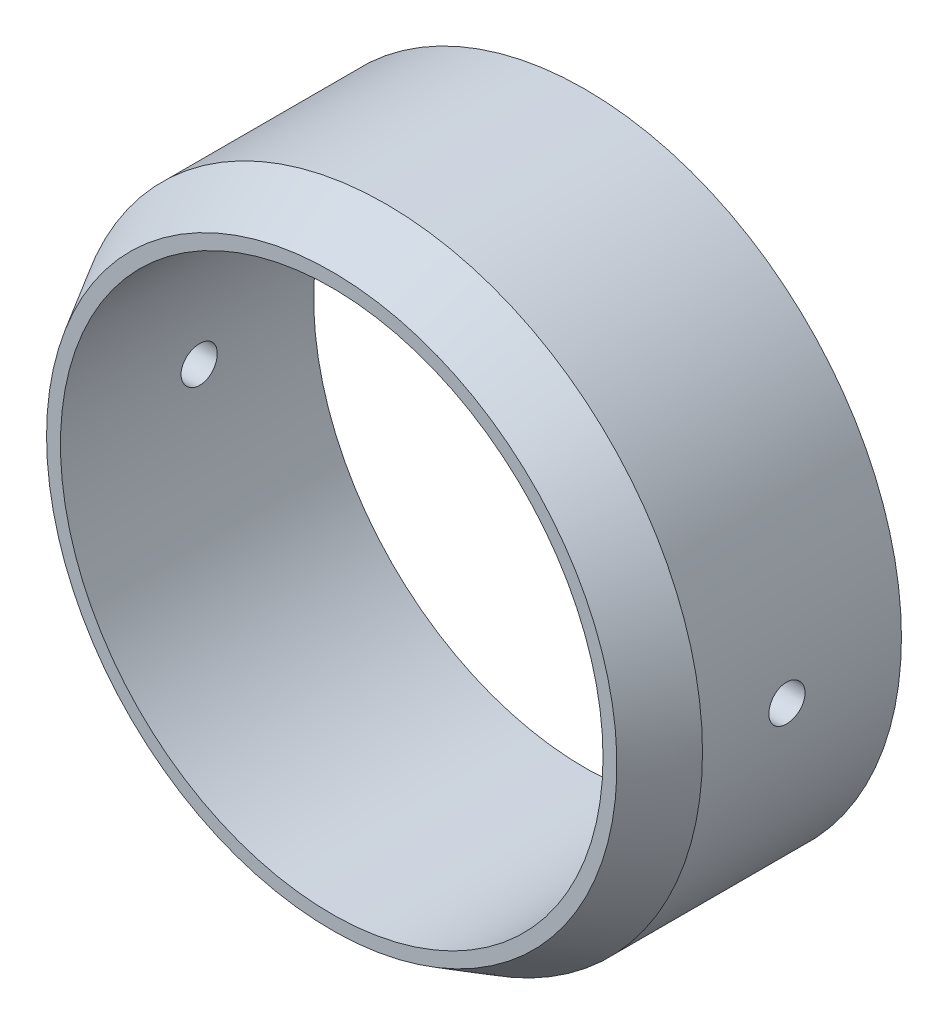
ISO-10303-21;
HEADER;
FILE_DESCRIPTION(('STEP AP214'),'2;1');
FILE_NAME('part.step','',(''),(''),'','','');
FILE_SCHEMA(('AUTOMOTIVE_DESIGN { 1 0 10303 214 1 1 1 1 }'));
ENDSEC;
DATA;
#1=APPLICATION_CONTEXT('core data for automotive mechanical design processes');
#2=APPLICATION_PROTOCOL_DEFINITION('international standard','automotive_design',2000,#1);
#3=PRODUCT_CONTEXT('',#1,'mechanical');
#4=PRODUCT('Part','Part','',(#3));
#5=PRODUCT_RELATED_PRODUCT_CATEGORY('part','',(#4));
#6=PRODUCT_DEFINITION_FORMATION('','',#4);
#7=PRODUCT_DEFINITION_CONTEXT('part definition',#1,'design');
#8=PRODUCT_DEFINITION('design','',#6,#7);
#9=PRODUCT_DEFINITION_SHAPE('','',#8);
#10=(LENGTH_UNIT() NAMED_UNIT(*) SI_UNIT(.MILLI.,.METRE.));
#11=(NAMED_UNIT(*) PLANE_ANGLE_UNIT() SI_UNIT($,.RADIAN.));
#12=(NAMED_UNIT(*) SI_UNIT($,.STERADIAN.) SOLID_ANGLE_UNIT());
#13=UNCERTAINTY_MEASURE_WITH_UNIT(LENGTH_MEASURE(1.E-05),#10,'distance_accuracy_value','');
#14=(GEOMETRIC_REPRESENTATION_CONTEXT(3) GLOBAL_UNCERTAINTY_ASSIGNED_CONTEXT((#13)) GLOBAL_UNIT_ASSIGNED_CONTEXT((#10,
#11,#12)) REPRESENTATION_CONTEXT('',''));
#15=CARTESIAN_POINT('',(0.,0.,0.));
#16=DIRECTION('',(0.,0.,1.));
#17=DIRECTION('',(1.,0.,0.));
#18=AXIS2_PLACEMENT_3D('',#15,#16,#17);
#19=CARTESIAN_POINT('',(0.,0.,35.56));
#20=DIRECTION('',(0.,0.,1.));
#21=DIRECTION('',(1.,0.,0.));
#22=AXIS2_PLACEMENT_3D('',#19,#20,#21);
#23=PLANE('',#22);
#24=CARTESIAN_POINT('',(0.,0.,35.56));
#25=DIRECTION('',(0.,0.,1.));
#26=DIRECTION('',(1.,0.,0.));
#27=AXIS2_PLACEMENT_3D('',#24,#25,#26);
#28=CIRCLE('',#27,40.0505909487751);
#29=CARTESIAN_POINT('',(-40.0505909487751,0.,35.56));
#30=VERTEX_POINT('',#29);
#31=EDGE_CURVE('E51',#30,#30,#28,.T.);
#32=ORIENTED_EDGE('',*,*,#31,.T.);
#33=EDGE_LOOP('',(#32));
#34=FACE_BOUND('',#33,.T.);
#35=CARTESIAN_POINT('',(0.,0.,35.56));
#36=DIRECTION('',(0.,0.,1.));
#37=DIRECTION('',(1.,0.,0.));
#38=AXIS2_PLACEMENT_3D('',#35,#36,#37);
#39=CIRCLE('',#38,38.1);
#40=CARTESIAN_POINT('',(38.1,0.,35.56));
#41=VERTEX_POINT('',#40);
#42=EDGE_CURVE('E107',#41,#41,#39,.T.);
#43=ORIENTED_EDGE('',*,*,#42,.F.);
#44=EDGE_LOOP('',(#43));
#45=FACE_BOUND('',#44,.T.);
#46=ADVANCED_FACE('F37',(#34,#45),#23,.T.);
#47=CARTESIAN_POINT('',(0.,0.,0.));
#48=DIRECTION('',(0.,0.,1.));
#49=DIRECTION('',(1.,0.,0.));
#50=AXIS2_PLACEMENT_3D('',#47,#48,#49);
#51=PLANE('',#50);
#52=CARTESIAN_POINT('',(0.,0.,0.));
#53=DIRECTION('',(0.,0.,1.));
#54=DIRECTION('',(1.,0.,0.));
#55=AXIS2_PLACEMENT_3D('',#52,#53,#54);
#56=CIRCLE('',#55,44.45);
#57=CARTESIAN_POINT('',(44.45,0.,0.));
#58=VERTEX_POINT('',#57);
#59=EDGE_CURVE('E57',#58,#58,#56,.T.);
#60=ORIENTED_EDGE('',*,*,#59,.F.);
#61=EDGE_LOOP('',(#60));
#62=FACE_BOUND('',#61,.T.);
#63=CARTESIAN_POINT('',(0.,0.,0.));
#64=DIRECTION('',(0.,0.,1.));
#65=DIRECTION('',(1.,0.,0.));
#66=AXIS2_PLACEMENT_3D('',#63,#64,#65);
#67=CIRCLE('',#66,38.1);
#68=CARTESIAN_POINT('',(38.1,0.,0.));
#69=VERTEX_POINT('',#68);
#70=EDGE_CURVE('E110',#69,#69,#67,.T.);
#71=ORIENTED_EDGE('',*,*,#70,.T.);
#72=EDGE_LOOP('',(#71));
#73=FACE_BOUND('',#72,.T.);
#74=ADVANCED_FACE('F94',(#62,#73),#51,.F.);
#75=CARTESIAN_POINT('',(0.,0.,35.56));
#76=DIRECTION('',(0.,0.,-1.));
#77=DIRECTION('',(-1.,0.,0.));
#78=AXIS2_PLACEMENT_3D('',#75,#76,#77);
#79=CYLINDRICAL_SURFACE('',#78,44.45);
#80=CARTESIAN_POINT('',(-44.45,0.,13.5382));
#81=CARTESIAN_POINT('',(-44.4499990324189,0.142548110969174,13.5382062809326));
#82=CARTESIAN_POINT('',(-44.4493069487451,0.285196616573273,13.5502402929722));
#83=CARTESIAN_POINT('',(-44.4466126248642,0.566556457090526,13.5980745659668));
#84=CARTESIAN_POINT('',(-44.4446088512392,0.705262985404416,13.6339026438486));
#85=CARTESIAN_POINT('',(-44.4395178795271,0.974622519959309,13.7282941164584));
#86=CARTESIAN_POINT('',(-44.4364312442148,1.1052796681625,13.7868457032124));
#87=CARTESIAN_POINT('',(-44.4295219231351,1.35487635297572,13.9250034363416));
#88=CARTESIAN_POINT('',(-44.4256994083529,1.47381860191533,14.0046046933229));
#89=CARTESIAN_POINT('',(-44.417742699632,1.69679560844934,14.1827141092181));
#90=CARTESIAN_POINT('',(-44.4136081609573,1.80081349791098,14.2812433718317));
#91=CARTESIAN_POINT('',(-44.4054963468139,1.99084503945253,14.494368918757));
#92=CARTESIAN_POINT('',(-44.4015190778544,2.07685794696125,14.6089658671987));
#93=CARTESIAN_POINT('',(-44.3941677388462,2.2284878908032,14.8510667198102));
#94=CARTESIAN_POINT('',(-44.3907940746642,2.29409122538185,14.9785792188982));
#95=CARTESIAN_POINT('',(-44.3850347565849,2.40295203059249,15.2428312070954));
#96=CARTESIAN_POINT('',(-44.3826490934902,2.44620970924265,15.3795706102969));
#97=CARTESIAN_POINT('',(-44.3791380294191,2.50910528831791,15.6582350486536));
#98=CARTESIAN_POINT('',(-44.3780112417441,2.52876917995537,15.8001541997453));
#99=CARTESIAN_POINT('',(-44.3771408387526,2.54399921632155,16.0852830763599));
#100=CARTESIAN_POINT('',(-44.3773972099368,2.53956559623517,16.2284927892737));
#101=CARTESIAN_POINT('',(-44.3792629258193,2.50674806430771,16.5119606900492));
#102=CARTESIAN_POINT('',(-44.3808706828291,2.47839225753024,16.6522221435788));
#103=CARTESIAN_POINT('',(-44.3852554740054,2.39857884530307,16.9259910868181));
#104=CARTESIAN_POINT('',(-44.3880325142384,2.34712111999487,17.0594985414823));
#105=CARTESIAN_POINT('',(-44.3944447270903,2.22253257271578,17.3160601134959));
#106=CARTESIAN_POINT('',(-44.3980804054095,2.14938897220624,17.4391080123245));
#107=CARTESIAN_POINT('',(-44.4057996399773,1.98351423300362,17.6711895986928));
#108=CARTESIAN_POINT('',(-44.4098832004071,1.89078291144249,17.7802231553813));
#109=CARTESIAN_POINT('',(-44.4180450318436,1.6882065990933,17.9813445417599));
#110=CARTESIAN_POINT('',(-44.4221232868888,1.57833727855314,18.0734078681274));
#111=CARTESIAN_POINT('',(-44.4298092556839,1.34468914280825,18.2377865359344));
#112=CARTESIAN_POINT('',(-44.4334169692932,1.22091032344745,18.3101018714731));
#113=CARTESIAN_POINT('',(-44.439755519285,0.962942193062774,18.4329295924821));
#114=CARTESIAN_POINT('',(-44.4424863196787,0.828752455052521,18.483441083146));
#115=CARTESIAN_POINT('',(-44.4467628003787,0.553778150400031,18.561211071254));
#116=CARTESIAN_POINT('',(-44.4483084922605,0.412993648185005,18.588469795815));
#117=CARTESIAN_POINT('',(-44.4500390787318,0.129038823810357,18.618930188302));
#118=CARTESIAN_POINT('',(-44.450225890018,-0.0141278523047366,18.6221657409656));
#119=CARTESIAN_POINT('',(-44.4492227569685,-0.298969994879581,18.6045764307314));
#120=CARTESIAN_POINT('',(-44.4480328186059,-0.440645467806297,18.5837516722204));
#121=CARTESIAN_POINT('',(-44.4444114083407,-0.718388333463661,18.5186609294604));
#122=CARTESIAN_POINT('',(-44.4419807580683,-0.854459373225275,18.4744104575802));
#123=CARTESIAN_POINT('',(-44.4361514716486,-1.11724328229386,18.3637401378942));
#124=CARTESIAN_POINT('',(-44.4327528282173,-1.24395608117207,18.2973201232643));
#125=CARTESIAN_POINT('',(-44.4253648664061,-1.48458195883466,18.1441096537158));
#126=CARTESIAN_POINT('',(-44.4213748925417,-1.59848058355821,18.0572965299346));
#127=CARTESIAN_POINT('',(-44.4132556389646,-1.81009952321742,17.8657972000757));
#128=CARTESIAN_POINT('',(-44.409126358099,-1.90781970421529,17.7611108460441));
#129=CARTESIAN_POINT('',(-44.40118837965,-2.08442230346029,17.5366907167522));
#130=CARTESIAN_POINT('',(-44.3973800590236,-2.16328276589876,17.4169396486957));
#131=CARTESIAN_POINT('',(-44.3905194282829,-2.29977724439363,17.1658765036846));
#132=CARTESIAN_POINT('',(-44.3874671141291,-2.35741137386724,17.0345644885074));
#133=CARTESIAN_POINT('',(-44.3824654107082,-2.44977902365166,16.7641876326082));
#134=CARTESIAN_POINT('',(-44.3805153521082,-2.48452644379505,16.6251275533025));
#135=CARTESIAN_POINT('',(-44.3779361994804,-2.53017974876046,16.3431356139566));
#136=CARTESIAN_POINT('',(-44.3773070949042,-2.5410858239653,16.2002037848432));
#137=CARTESIAN_POINT('',(-44.3774410498713,-2.53874505508096,15.9147440588276));
#138=CARTESIAN_POINT('',(-44.3782021193232,-2.52553273748035,15.7722158765856));
#139=CARTESIAN_POINT('',(-44.3810264407149,-2.47540172067651,15.4914050100724));
#140=CARTESIAN_POINT('',(-44.3830896950738,-2.4384829774323,15.3531223336889));
#141=CARTESIAN_POINT('',(-44.3882853891516,-2.34199457776633,15.0847217771291));
#142=CARTESIAN_POINT('',(-44.3914178290496,-2.2824249175511,14.9546038983201));
#143=CARTESIAN_POINT('',(-44.3983987975748,-2.14233083223591,14.7062126919853));
#144=CARTESIAN_POINT('',(-44.4022473060956,-2.06180699547971,14.5879390320307));
#145=CARTESIAN_POINT('',(-44.4102330656436,-1.88196406448632,14.3664194528695));
#146=CARTESIAN_POINT('',(-44.4143706907681,-1.78262032329066,14.2631935578065));
#147=CARTESIAN_POINT('',(-44.4224653916266,-1.56798482474032,14.074850101875));
#148=CARTESIAN_POINT('',(-44.4264224228277,-1.45268916175373,13.9897369886912));
#149=CARTESIAN_POINT('',(-44.4337135223396,-1.20931004986795,13.8399829628417));
#150=CARTESIAN_POINT('',(-44.437046894753,-1.08121255784549,13.7753648639142));
#151=CARTESIAN_POINT('',(-44.4427052976532,-0.816061906225686,13.6686313240014));
#152=CARTESIAN_POINT('',(-44.4450315130628,-0.679019490095359,13.6264894260914));
#153=CARTESIAN_POINT('',(-44.447801300932,-0.450943893387478,13.5769035816224));
#154=CARTESIAN_POINT('',(-44.4486221673832,-0.361386382398327,13.5624083974629));
#155=CARTESIAN_POINT('',(-44.4497218242187,-0.181232776087378,13.5430546153194));
#156=CARTESIAN_POINT('',(-44.4500006152192,-0.090636681946349,13.5381960063806));
#157=CARTESIAN_POINT('',(-44.45,0.,13.5382));
#158=B_SPLINE_CURVE_WITH_KNOTS('',3,(#80,#81,#82,#83,#84,#85,#86,#87,#88,#89,#90,#91,#92,#93,
#94,#95,#96,#97,#98,#99,#100,#101,#102,#103,#104,#105,#106,#107,#108,#109,#110,#111,#112,#113,
#114,#115,#116,#117,#118,#119,#120,#121,#122,#123,#124,#125,#126,#127,#128,#129,#130,#131,#132,
#133,#134,#135,#136,#137,#138,#139,#140,#141,#142,#143,#144,#145,#146,#147,#148,#149,#150,#151,
#152,#153,#154,#155,#156,#157),.UNSPECIFIED.,.T.,.F.,(4,2,2,2,2,2,2,2,2,2,2,2,2,2,2,2,2,2,2,2,2,
2,2,2,2,2,2,2,2,2,2,2,2,2,2,2,2,2,4),(0.,0.427313464374931,0.855127369531934,1.28271926380893,
1.71021192462679,2.13818401226944,2.56617379461238,2.9944502864928,3.4227227914283,
3.85052307155006,4.27831917646952,4.70561338244867,5.13290980536226,5.56045851751044,
5.98801122136637,6.4161765140174,6.84434193460178,7.27252492496605,7.70070373309051,
8.12827847910963,8.55585137008207,8.9831414783331,9.41043480197916,9.8382053690021,
10.2659794772668,10.6942491866998,11.1225166077552,11.5505236878496,11.9785273501211,
12.4059187876659,12.8333110192064,13.2607033223246,13.6880836265711,14.116027555884,
14.5440764480341,14.9726001580508,15.4006183296802,15.6723183075114,15.9440179764766),.UNSPECIFIED.);
#159=CARTESIAN_POINT('',(-44.45,0.,13.5382));
#160=VERTEX_POINT('',#159);
#161=EDGE_CURVE('E85',#160,#160,#158,.T.);
#162=ORIENTED_EDGE('',*,*,#161,.T.);
#163=EDGE_LOOP('',(#162));
#164=FACE_BOUND('',#163,.T.);
#165=CARTESIAN_POINT('',(44.45,0.,13.5382));
#166=CARTESIAN_POINT('',(44.4499990324189,-0.142548110969174,13.5382062809326));
#167=CARTESIAN_POINT('',(44.4493069487451,-0.285196616573273,13.5502402929722));
#168=CARTESIAN_POINT('',(44.4466126248642,-0.566556457090526,13.5980745659668));
#169=CARTESIAN_POINT('',(44.4446088512392,-0.705262985404416,13.6339026438486));
#170=CARTESIAN_POINT('',(44.4395178795271,-0.974622519959309,13.7282941164584));
#171=CARTESIAN_POINT('',(44.4364312442148,-1.1052796681625,13.7868457032124));
#172=CARTESIAN_POINT('',(44.4295219231351,-1.35487635297572,13.9250034363416));
#173=CARTESIAN_POINT('',(44.4256994083529,-1.47381860191533,14.0046046933229));
#174=CARTESIAN_POINT('',(44.417742699632,-1.69679560844934,14.1827141092181));
#175=CARTESIAN_POINT('',(44.4136081609573,-1.80081349791098,14.2812433718317));
#176=CARTESIAN_POINT('',(44.4054963468139,-1.99084503945253,14.494368918757));
#177=CARTESIAN_POINT('',(44.4015190778544,-2.07685794696125,14.6089658671987));
#178=CARTESIAN_POINT('',(44.3941677388462,-2.2284878908032,14.8510667198102));
#179=CARTESIAN_POINT('',(44.3907940746642,-2.29409122538185,14.9785792188982));
#180=CARTESIAN_POINT('',(44.3850347565849,-2.40295203059249,15.2428312070954));
#181=CARTESIAN_POINT('',(44.3826490934902,-2.44620970924265,15.3795706102969));
#182=CARTESIAN_POINT('',(44.3791380294191,-2.50910528831791,15.6582350486536));
#183=CARTESIAN_POINT('',(44.3780112417441,-2.52876917995537,15.8001541997453));
#184=CARTESIAN_POINT('',(44.3771408387526,-2.54399921632155,16.0852830763599));
#185=CARTESIAN_POINT('',(44.3773972099368,-2.53956559623517,16.2284927892737));
#186=CARTESIAN_POINT('',(44.3792629258193,-2.50674806430771,16.5119606900492));
#187=CARTESIAN_POINT('',(44.3808706828291,-2.47839225753024,16.6522221435788));
#188=CARTESIAN_POINT('',(44.3852554740054,-2.39857884530307,16.9259910868181));
#189=CARTESIAN_POINT('',(44.3880325142384,-2.34712111999487,17.0594985414823));
#190=CARTESIAN_POINT('',(44.3944447270903,-2.22253257271578,17.3160601134959));
#191=CARTESIAN_POINT('',(44.3980804054095,-2.14938897220624,17.4391080123245));
#192=CARTESIAN_POINT('',(44.4057996399773,-1.98351423300362,17.6711895986928));
#193=CARTESIAN_POINT('',(44.4098832004071,-1.89078291144249,17.7802231553813));
#194=CARTESIAN_POINT('',(44.4180450318436,-1.6882065990933,17.9813445417599));
#195=CARTESIAN_POINT('',(44.4221232868888,-1.57833727855314,18.0734078681274));
#196=CARTESIAN_POINT('',(44.4298092556839,-1.34468914280825,18.2377865359344));
#197=CARTESIAN_POINT('',(44.4334169692932,-1.22091032344745,18.3101018714731));
#198=CARTESIAN_POINT('',(44.439755519285,-0.962942193062774,18.4329295924821));
#199=CARTESIAN_POINT('',(44.4424863196787,-0.828752455052521,18.483441083146));
#200=CARTESIAN_POINT('',(44.4467628003787,-0.553778150400031,18.561211071254));
#201=CARTESIAN_POINT('',(44.4483084922605,-0.412993648185005,18.588469795815));
#202=CARTESIAN_POINT('',(44.4500390787318,-0.129038823810357,18.618930188302));
#203=CARTESIAN_POINT('',(44.450225890018,0.0141278523047366,18.6221657409656));
#204=CARTESIAN_POINT('',(44.4492227569685,0.298969994879581,18.6045764307314));
#205=CARTESIAN_POINT('',(44.4480328186059,0.440645467806297,18.5837516722204));
#206=CARTESIAN_POINT('',(44.4444114083407,0.718388333463661,18.5186609294604));
#207=CARTESIAN_POINT('',(44.4419807580683,0.854459373225275,18.4744104575802));
#208=CARTESIAN_POINT('',(44.4361514716486,1.11724328229386,18.3637401378942));
#209=CARTESIAN_POINT('',(44.4327528282173,1.24395608117207,18.2973201232643));
#210=CARTESIAN_POINT('',(44.4253648664061,1.48458195883466,18.1441096537158));
#211=CARTESIAN_POINT('',(44.4213748925417,1.59848058355821,18.0572965299346));
#212=CARTESIAN_POINT('',(44.4132556389646,1.81009952321742,17.8657972000757));
#213=CARTESIAN_POINT('',(44.409126358099,1.90781970421529,17.7611108460441));
#214=CARTESIAN_POINT('',(44.40118837965,2.08442230346029,17.5366907167522));
#215=CARTESIAN_POINT('',(44.3973800590236,2.16328276589876,17.4169396486957));
#216=CARTESIAN_POINT('',(44.3905194282829,2.29977724439363,17.1658765036846));
#217=CARTESIAN_POINT('',(44.3874671141291,2.35741137386724,17.0345644885074));
#218=CARTESIAN_POINT('',(44.3824654107082,2.44977902365166,16.7641876326082));
#219=CARTESIAN_POINT('',(44.3805153521082,2.48452644379505,16.6251275533025));
#220=CARTESIAN_POINT('',(44.3779361994804,2.53017974876046,16.3431356139566));
#221=CARTESIAN_POINT('',(44.3773070949042,2.5410858239653,16.2002037848432));
#222=CARTESIAN_POINT('',(44.3774410498713,2.53874505508096,15.9147440588276));
#223=CARTESIAN_POINT('',(44.3782021193232,2.52553273748035,15.7722158765856));
#224=CARTESIAN_POINT('',(44.3810264407149,2.47540172067651,15.4914050100724));
#225=CARTESIAN_POINT('',(44.3830896950738,2.4384829774323,15.3531223336889));
#226=CARTESIAN_POINT('',(44.3882853891516,2.34199457776633,15.0847217771291));
#227=CARTESIAN_POINT('',(44.3914178290496,2.2824249175511,14.9546038983201));
#228=CARTESIAN_POINT('',(44.3983987975748,2.14233083223591,14.7062126919853));
#229=CARTESIAN_POINT('',(44.4022473060956,2.06180699547971,14.5879390320307));
#230=CARTESIAN_POINT('',(44.4102330656436,1.88196406448632,14.3664194528695));
#231=CARTESIAN_POINT('',(44.4143706907681,1.78262032329066,14.2631935578065));
#232=CARTESIAN_POINT('',(44.4224653916266,1.56798482474032,14.074850101875));
#233=CARTESIAN_POINT('',(44.4264224228277,1.45268916175373,13.9897369886912));
#234=CARTESIAN_POINT('',(44.4337135223396,1.20931004986795,13.8399829628417));
#235=CARTESIAN_POINT('',(44.437046894753,1.08121255784549,13.7753648639142));
#236=CARTESIAN_POINT('',(44.4427052976532,0.816061906225686,13.6686313240014));
#237=CARTESIAN_POINT('',(44.4450315130628,0.679019490095359,13.6264894260914));
#238=CARTESIAN_POINT('',(44.447801300932,0.450943893387478,13.5769035816224));
#239=CARTESIAN_POINT('',(44.4486221673832,0.361386382398327,13.5624083974629));
#240=CARTESIAN_POINT('',(44.4497218242187,0.181232776087378,13.5430546153194));
#241=CARTESIAN_POINT('',(44.4500006152192,0.090636681946349,13.5381960063806));
#242=CARTESIAN_POINT('',(44.45,0.,13.5382));
#243=B_SPLINE_CURVE_WITH_KNOTS('',3,(#165,#166,#167,#168,#169,#170,#171,#172,#173,#174,#175,
#176,#177,#178,#179,#180,#181,#182,#183,#184,#185,#186,#187,#188,#189,#190,#191,#192,#193,#194,
#195,#196,#197,#198,#199,#200,#201,#202,#203,#204,#205,#206,#207,#208,#209,#210,#211,#212,#213,
#214,#215,#216,#217,#218,#219,#220,#221,#222,#223,#224,#225,#226,#227,#228,#229,#230,#231,#232,
#233,#234,#235,#236,#237,#238,#239,#240,#241,#242),.UNSPECIFIED.,.T.,.F.,(4,2,2,2,2,2,2,2,2,2,2,
2,2,2,2,2,2,2,2,2,2,2,2,2,2,2,2,2,2,2,2,2,2,2,2,2,2,2,4),(0.,0.427313464374931,
0.855127369531934,1.28271926380893,1.71021192462679,2.13818401226944,2.56617379461238,
2.9944502864928,3.4227227914283,3.85052307155006,4.27831917646952,4.70561338244867,
5.13290980536226,5.56045851751044,5.98801122136637,6.4161765140174,6.84434193460178,
7.27252492496605,7.70070373309051,8.12827847910963,8.55585137008207,8.9831414783331,
9.41043480197916,9.8382053690021,10.2659794772668,10.6942491866998,11.1225166077552,
11.5505236878496,11.9785273501211,12.4059187876659,12.8333110192064,13.2607033223246,
13.6880836265711,14.116027555884,14.5440764480341,14.9726001580508,15.4006183296802,
15.6723183075114,15.9440179764766),.UNSPECIFIED.);
#244=CARTESIAN_POINT('',(44.45,0.,13.5382));
#245=VERTEX_POINT('',#244);
#246=EDGE_CURVE('E79',#245,#245,#243,.T.);
#247=ORIENTED_EDGE('',*,*,#246,.T.);
#248=EDGE_LOOP('',(#247));
#249=FACE_BOUND('',#248,.T.);
#250=CARTESIAN_POINT('',(0.,0.,27.94));
#251=DIRECTION('',(0.,0.,1.));
#252=DIRECTION('',(1.,0.,0.));
#253=AXIS2_PLACEMENT_3D('',#250,#251,#252);
#254=CIRCLE('',#253,44.45);
#255=CARTESIAN_POINT('',(-44.45,0.,27.94));
#256=VERTEX_POINT('',#255);
#257=EDGE_CURVE('E10',#256,#256,#254,.F.);
#258=ORIENTED_EDGE('',*,*,#257,.T.);
#259=EDGE_LOOP('',(#258));
#260=FACE_BOUND('',#259,.T.);
#261=ORIENTED_EDGE('',*,*,#59,.T.);
#262=EDGE_LOOP('',(#261));
#263=FACE_BOUND('',#262,.T.);
#264=ADVANCED_FACE('F90',(#164,#249,#260,#263),#79,.T.);
#265=CARTESIAN_POINT('',(0.,0.,35.56));
#266=DIRECTION('',(0.,0.,-1.));
#267=DIRECTION('',(-1.,0.,0.));
#268=AXIS2_PLACEMENT_3D('',#265,#266,#267);
#269=CYLINDRICAL_SURFACE('',#268,38.1);
#270=CARTESIAN_POINT('',(-38.1,0.,18.6182));
#271=CARTESIAN_POINT('',(-38.099998877281,-0.142503120642477,18.6181937375075));
#272=CARTESIAN_POINT('',(-38.0991919609892,-0.285105531001272,18.6061672894215));
#273=CARTESIAN_POINT('',(-38.0960505888234,-0.566371367790756,18.5583648142742));
#274=CARTESIAN_POINT('',(-38.0937143634537,-0.705030036932484,18.5225612750973));
#275=CARTESIAN_POINT('',(-38.0877786124672,-0.974293625093628,18.4282387971924));
#276=CARTESIAN_POINT('',(-38.0841797619533,-1.10490280424172,18.3697319957199));
#277=CARTESIAN_POINT('',(-38.0761233214529,-1.35441300181879,18.2316838383851));
#278=CARTESIAN_POINT('',(-38.0716659258874,-1.47331666181527,18.1521472432874));
#279=CARTESIAN_POINT('',(-38.0623848797192,-1.69627448262546,17.97415099452));
#280=CARTESIAN_POINT('',(-38.0575606942967,-1.80030629696361,17.8756633752374));
#281=CARTESIAN_POINT('',(-38.0480943324951,-1.9903760913189,17.6626187976416));
#282=CARTESIAN_POINT('',(-38.0434521637953,-2.0764133128143,17.5480611622727));
#283=CARTESIAN_POINT('',(-38.0348691515272,-2.22812218922981,17.3059997000232));
#284=CARTESIAN_POINT('',(-38.0309289578168,-2.293775014489,17.1784840468765));
#285=CARTESIAN_POINT('',(-38.0242012506223,-2.40273102737466,16.9142090607782));
#286=CARTESIAN_POINT('',(-38.0214137233391,-2.44603448255859,16.7774498385089));
#287=CARTESIAN_POINT('',(-38.0173108527936,-2.50899980645794,16.4987873106911));
#288=CARTESIAN_POINT('',(-38.0159933074271,-2.528697041726,16.3568920293551));
#289=CARTESIAN_POINT('',(-38.0149723901325,-2.54399998567041,16.0718035237756));
#290=CARTESIAN_POINT('',(-38.0152689977985,-2.53960599890227,15.928610315963));
#291=CARTESIAN_POINT('',(-38.0174408942233,-2.50688055080277,15.6452319149212));
#292=CARTESIAN_POINT('',(-38.0193136570947,-2.47858738913125,15.5050422766725));
#293=CARTESIAN_POINT('',(-38.0244228480875,-2.39892615360203,15.2314064423117));
#294=CARTESIAN_POINT('',(-38.027659285297,-2.3475579259621,15.0979602911476));
#295=CARTESIAN_POINT('',(-38.0351340197238,-2.22316134008134,14.8414766048706));
#296=CARTESIAN_POINT('',(-38.0393731184284,-2.15011564178293,14.7184475041245));
#297=CARTESIAN_POINT('',(-38.0483746836947,-1.98445016602498,14.4863824762215));
#298=CARTESIAN_POINT('',(-38.0531371569767,-1.89183013720452,14.3773467287871));
#299=CARTESIAN_POINT('',(-38.0626600121478,-1.68942959251528,14.176140723792));
#300=CARTESIAN_POINT('',(-38.0674203718138,-1.57961593702371,14.0840037982506));
#301=CARTESIAN_POINT('',(-38.0763936382668,-1.3460614218084,13.919468079085));
#302=CARTESIAN_POINT('',(-38.0806065448369,-1.22232055656502,13.8470692932834));
#303=CARTESIAN_POINT('',(-38.0880105952836,-0.964403696623923,13.7240676782149));
#304=CARTESIAN_POINT('',(-38.091201678199,-0.830227079930622,13.6734661492935));
#305=CARTESIAN_POINT('',(-38.096201707964,-0.555256690043961,13.5955178950963));
#306=CARTESIAN_POINT('',(-38.0980106731746,-0.414463004782528,13.5681708608918));
#307=CARTESIAN_POINT('',(-38.1000402677273,-0.130544242656487,13.5375492665883));
#308=CARTESIAN_POINT('',(-38.1002639372586,0.0125758439029844,13.5342286297849));
#309=CARTESIAN_POINT('',(-38.0991058293722,0.297338932056023,13.5516336441307));
#310=CARTESIAN_POINT('',(-38.0977240614778,0.438981942406444,13.5723591526403));
#311=CARTESIAN_POINT('',(-38.0935125589844,0.716640071744602,13.6372299781012));
#312=CARTESIAN_POINT('',(-38.0906841338661,0.852660160332753,13.6813541164791));
#313=CARTESIAN_POINT('',(-38.0838974382059,1.11536482035605,13.7917481484419));
#314=CARTESIAN_POINT('',(-38.0799391561176,1.24204929637105,13.8580182683445));
#315=CARTESIAN_POINT('',(-38.0713297471279,1.48269739371354,14.0109401260466));
#316=CARTESIAN_POINT('',(-38.0666775795321,1.59664144987429,14.0976225934382));
#317=CARTESIAN_POINT('',(-38.0572072924702,1.80837720022208,14.2888638806961));
#318=CARTESIAN_POINT('',(-38.0523891711513,1.90616871399595,14.3934229002051));
#319=CARTESIAN_POINT('',(-38.043121167233,2.08297987133062,14.6176482435886));
#320=CARTESIAN_POINT('',(-38.0386718788828,2.16196959110581,14.7373381915518));
#321=CARTESIAN_POINT('',(-38.0306528042756,2.29873016023274,14.9883093059475));
#322=CARTESIAN_POINT('',(-38.0270830119911,2.35650115500253,15.1195903929347));
#323=CARTESIAN_POINT('',(-38.0212298111431,2.44913269818885,15.3899084919001));
#324=CARTESIAN_POINT('',(-38.018945350454,2.48401198882369,15.5289390576687));
#325=CARTESIAN_POINT('',(-38.0159175327319,2.52993120682806,15.8108988621497));
#326=CARTESIAN_POINT('',(-38.0151741578863,2.54097140974222,15.9538280557803));
#327=CARTESIAN_POINT('',(-38.015312778399,2.53889632817836,16.2392303856758));
#328=CARTESIAN_POINT('',(-38.016191608669,2.52582808178329,16.3817038678614));
#329=CARTESIAN_POINT('',(-38.0194689000508,2.47600468542499,16.6624286193678));
#330=CARTESIAN_POINT('',(-38.0218673638514,2.43924949355173,16.8006798812177));
#331=CARTESIAN_POINT('',(-38.0279128595762,2.34310640796841,17.0690420474305));
#332=CARTESIAN_POINT('',(-38.0315598736484,2.28371883785971,17.1991530681529));
#333=CARTESIAN_POINT('',(-38.0396914625414,2.14400294433319,17.447564144473));
#334=CARTESIAN_POINT('',(-38.044176017191,2.06367512522033,17.565864484413));
#335=CARTESIAN_POINT('',(-38.0534875951555,1.88418412835682,17.7875352630589));
#336=CARTESIAN_POINT('',(-38.0583152308288,1.78498671344082,17.890877952823));
#337=CARTESIAN_POINT('',(-38.067763644237,1.57062278344896,18.0794812635387));
#338=CARTESIAN_POINT('',(-38.0723843711759,1.45545237512779,18.1647374632484));
#339=CARTESIAN_POINT('',(-38.0809037073727,1.21226478105079,18.3148193965664));
#340=CARTESIAN_POINT('',(-38.0848013365264,1.0842305162451,18.3796174829924));
#341=CARTESIAN_POINT('',(-38.0914225308089,0.819165787165158,18.4867169742484));
#342=CARTESIAN_POINT('',(-38.0941474657613,0.682146035713956,18.5290446403471));
#343=CARTESIAN_POINT('',(-38.0974047239534,0.453577639381167,18.579039523554));
#344=CARTESIAN_POINT('',(-38.0983736086799,0.363505201771423,18.5937056200265));
#345=CARTESIAN_POINT('',(-38.0996716053424,0.182302055561928,18.6132878537984));
#346=CARTESIAN_POINT('',(-38.1000007182987,0.0911713486502643,18.6182040066483));
#347=CARTESIAN_POINT('',(-38.1,0.,18.6182));
#348=B_SPLINE_CURVE_WITH_KNOTS('',3,(#270,#271,#272,#273,#274,#275,#276,#277,#278,#279,#280,
#281,#282,#283,#284,#285,#286,#287,#288,#289,#290,#291,#292,#293,#294,#295,#296,#297,#298,#299,
#300,#301,#302,#303,#304,#305,#306,#307,#308,#309,#310,#311,#312,#313,#314,#315,#316,#317,#318,
#319,#320,#321,#322,#323,#324,#325,#326,#327,#328,#329,#330,#331,#332,#333,#334,#335,#336,#337,
#338,#339,#340,#341,#342,#343,#344,#345,#346,#347),.UNSPECIFIED.,.T.,.F.,(4,2,2,2,2,2,2,2,2,2,2,
2,2,2,2,2,2,2,2,2,2,2,2,2,2,2,2,2,2,2,2,2,2,2,2,2,2,2,4),(0.,0.427176524472501,
0.854848191708533,1.28229153823945,1.70963820206287,2.13762039654958,2.56562062803205,
2.99401504759841,3.42240433848424,3.85015101617714,4.27789228641049,4.70494937684426,
5.13200931341359,5.55941178516507,5.98681974567676,6.41506188599419,6.84330419603366,
7.27157204992158,7.69983421431501,8.12727485928527,8.55471296872925,8.98176485398539,
9.40882110357281,9.83652441841293,10.2642325100922,10.6926168311941,11.1209982163997,
11.5490284321825,11.977053700542,12.4042447303397,12.8314365159817,13.2586221937967,
13.68579758463,14.1137555696837,14.5418180488132,14.9704565615318,15.3985930137037,
15.6718945511618,15.9451956527258),.UNSPECIFIED.);
#349=CARTESIAN_POINT('',(-38.1,0.,18.6182));
#350=VERTEX_POINT('',#349);
#351=EDGE_CURVE('E41',#350,#350,#348,.T.);
#352=ORIENTED_EDGE('',*,*,#351,.F.);
#353=EDGE_LOOP('',(#352));
#354=FACE_BOUND('',#353,.T.);
#355=CARTESIAN_POINT('',(38.1,0.,13.5382));
#356=CARTESIAN_POINT('',(38.099998877281,-0.142503120642477,13.5382062624925));
#357=CARTESIAN_POINT('',(38.0991919609892,-0.285105531001272,13.5502327105785));
#358=CARTESIAN_POINT('',(38.0960505888234,-0.566371367790756,13.5980351857258));
#359=CARTESIAN_POINT('',(38.0937143634537,-0.705030036932484,13.6338387249027));
#360=CARTESIAN_POINT('',(38.0877786124672,-0.974293625093628,13.7281612028076));
#361=CARTESIAN_POINT('',(38.0841797619533,-1.10490280424172,13.7866680042801));
#362=CARTESIAN_POINT('',(38.0761233214529,-1.3544130018188,13.9247161616149));
#363=CARTESIAN_POINT('',(38.0716659258874,-1.47331666181527,14.0042527567126));
#364=CARTESIAN_POINT('',(38.0623848797192,-1.69627448262546,14.18224900548));
#365=CARTESIAN_POINT('',(38.0575606942967,-1.80030629696361,14.2807366247626));
#366=CARTESIAN_POINT('',(38.0480943324951,-1.9903760913189,14.4937812023584));
#367=CARTESIAN_POINT('',(38.0434521637953,-2.0764133128143,14.6083388377273));
#368=CARTESIAN_POINT('',(38.0348691515272,-2.22812218922981,14.8504002999768));
#369=CARTESIAN_POINT('',(38.0309289578168,-2.293775014489,14.9779159531235));
#370=CARTESIAN_POINT('',(38.0242012506223,-2.40273102737466,15.2421909392218));
#371=CARTESIAN_POINT('',(38.0214137233391,-2.44603448255859,15.3789501614911));
#372=CARTESIAN_POINT('',(38.0173108527936,-2.50899980645794,15.6576126893089));
#373=CARTESIAN_POINT('',(38.0159933074271,-2.528697041726,15.7995079706449));
#374=CARTESIAN_POINT('',(38.0149723901325,-2.54399998567041,16.0845964762244));
#375=CARTESIAN_POINT('',(38.0152689977985,-2.53960599890227,16.227789684037));
#376=CARTESIAN_POINT('',(38.0174408942233,-2.50688055080277,16.5111680850788));
#377=CARTESIAN_POINT('',(38.0193136570947,-2.47858738913125,16.6513577233275));
#378=CARTESIAN_POINT('',(38.0244228480875,-2.39892615360203,16.9249935576883));
#379=CARTESIAN_POINT('',(38.027659285297,-2.3475579259621,17.0584397088524));
#380=CARTESIAN_POINT('',(38.0351340197238,-2.22316134008134,17.3149233951294));
#381=CARTESIAN_POINT('',(38.0393731184284,-2.15011564178293,17.4379524958755));
#382=CARTESIAN_POINT('',(38.0483746836947,-1.98445016602498,17.6700175237785));
#383=CARTESIAN_POINT('',(38.0531371569767,-1.89183013720452,17.7790532712129));
#384=CARTESIAN_POINT('',(38.0626600121478,-1.68942959251528,17.980259276208));
#385=CARTESIAN_POINT('',(38.0674203718138,-1.57961593702371,18.0723962017494));
#386=CARTESIAN_POINT('',(38.0763936382668,-1.3460614218084,18.2369319209151));
#387=CARTESIAN_POINT('',(38.0806065448369,-1.22232055656502,18.3093307067166));
#388=CARTESIAN_POINT('',(38.0880105952836,-0.964403696623925,18.4323323217851));
#389=CARTESIAN_POINT('',(38.091201678199,-0.830227079930624,18.4829338507065));
#390=CARTESIAN_POINT('',(38.096201707964,-0.555256690043963,18.5608821049037));
#391=CARTESIAN_POINT('',(38.0980106731746,-0.414463004782528,18.5882291391082));
#392=CARTESIAN_POINT('',(38.1000402677273,-0.130544242656486,18.6188507334117));
#393=CARTESIAN_POINT('',(38.1002639372586,0.0125758439029858,18.6221713702151));
#394=CARTESIAN_POINT('',(38.0991058293722,0.297338932056024,18.6047663558693));
#395=CARTESIAN_POINT('',(38.0977240614778,0.438981942406445,18.5840408473597));
#396=CARTESIAN_POINT('',(38.0935125589844,0.716640071744602,18.5191700218988));
#397=CARTESIAN_POINT('',(38.0906841338661,0.852660160332752,18.4750458835209));
#398=CARTESIAN_POINT('',(38.0838974382059,1.11536482035605,18.3646518515581));
#399=CARTESIAN_POINT('',(38.0799391561176,1.24204929637105,18.2983817316555));
#400=CARTESIAN_POINT('',(38.0713297471279,1.48269739371354,18.1454598739534));
#401=CARTESIAN_POINT('',(38.0666775795321,1.59664144987428,18.0587774065618));
#402=CARTESIAN_POINT('',(38.0572072924702,1.80837720022208,17.8675361193039));
#403=CARTESIAN_POINT('',(38.0523891711513,1.90616871399594,17.7629770997949));
#404=CARTESIAN_POINT('',(38.043121167233,2.08297987133062,17.5387517564114));
#405=CARTESIAN_POINT('',(38.0386718788828,2.16196959110581,17.4190618084482));
#406=CARTESIAN_POINT('',(38.0306528042756,2.29873016023274,17.1680906940525));
#407=CARTESIAN_POINT('',(38.0270830119911,2.35650115500253,17.0368096070653));
#408=CARTESIAN_POINT('',(38.0212298111431,2.44913269818885,16.7664915080999));
#409=CARTESIAN_POINT('',(38.018945350454,2.48401198882369,16.6274609423313));
#410=CARTESIAN_POINT('',(38.0159175327319,2.52993120682806,16.3455011378503));
#411=CARTESIAN_POINT('',(38.0151741578863,2.54097140974222,16.2025719442197));
#412=CARTESIAN_POINT('',(38.015312778399,2.53889632817836,15.9171696143242));
#413=CARTESIAN_POINT('',(38.016191608669,2.52582808178329,15.7746961321386));
#414=CARTESIAN_POINT('',(38.0194689000508,2.47600468542499,15.4939713806322));
#415=CARTESIAN_POINT('',(38.0218673638514,2.43924949355173,15.3557201187823));
#416=CARTESIAN_POINT('',(38.0279128595762,2.34310640796841,15.0873579525695));
#417=CARTESIAN_POINT('',(38.0315598736484,2.28371883785971,14.9572469318471));
#418=CARTESIAN_POINT('',(38.0396914625414,2.14400294433319,14.708835855527));
#419=CARTESIAN_POINT('',(38.044176017191,2.06367512522033,14.590535515587));
#420=CARTESIAN_POINT('',(38.0534875951555,1.88418412835682,14.3688647369411));
#421=CARTESIAN_POINT('',(38.0583152308288,1.78498671344082,14.265522047177));
#422=CARTESIAN_POINT('',(38.067763644237,1.57062278344896,14.0769187364613));
#423=CARTESIAN_POINT('',(38.0723843711759,1.4554523751278,13.9916625367516));
#424=CARTESIAN_POINT('',(38.0809037073727,1.21226478105079,13.8415806034336));
#425=CARTESIAN_POINT('',(38.0848013365264,1.0842305162451,13.7767825170076));
#426=CARTESIAN_POINT('',(38.0914225308089,0.819165787165157,13.6696830257516));
#427=CARTESIAN_POINT('',(38.0941474657613,0.682146035713955,13.6273553596529));
#428=CARTESIAN_POINT('',(38.0974047239534,0.453577639381166,13.577360476446));
#429=CARTESIAN_POINT('',(38.0983736086799,0.363505201771423,13.5626943799735));
#430=CARTESIAN_POINT('',(38.0996716053424,0.182302055561928,13.5431121462016));
#431=CARTESIAN_POINT('',(38.1000007182987,0.091171348650264,13.5381959933517));
#432=CARTESIAN_POINT('',(38.1,0.,13.5382));
#433=B_SPLINE_CURVE_WITH_KNOTS('',3,(#355,#356,#357,#358,#359,#360,#361,#362,#363,#364,#365,
#366,#367,#368,#369,#370,#371,#372,#373,#374,#375,#376,#377,#378,#379,#380,#381,#382,#383,#384,
#385,#386,#387,#388,#389,#390,#391,#392,#393,#394,#395,#396,#397,#398,#399,#400,#401,#402,#403,
#404,#405,#406,#407,#408,#409,#410,#411,#412,#413,#414,#415,#416,#417,#418,#419,#420,#421,#422,
#423,#424,#425,#426,#427,#428,#429,#430,#431,#432),.UNSPECIFIED.,.T.,.F.,(4,2,2,2,2,2,2,2,2,2,2,
2,2,2,2,2,2,2,2,2,2,2,2,2,2,2,2,2,2,2,2,2,2,2,2,2,2,2,4),(0.,0.427176524472501,
0.854848191708533,1.28229153823945,1.70963820206287,2.13762039654958,2.56562062803205,
2.99401504759841,3.42240433848424,3.85015101617714,4.27789228641049,4.70494937684426,
5.13200931341359,5.55941178516507,5.98681974567676,6.41506188599418,6.84330419603365,
7.27157204992158,7.69983421431501,8.12727485928527,8.55471296872924,8.98176485398539,
9.40882110357281,9.83652441841292,10.2642325100922,10.6926168311941,11.1209982163997,
11.5490284321825,11.977053700542,12.4042447303397,12.8314365159818,13.2586221937967,
13.68579758463,14.1137555696837,14.5418180488132,14.9704565615318,15.3985930137037,
15.6718945511618,15.9451956527258),.UNSPECIFIED.);
#434=CARTESIAN_POINT('',(38.1,0.,13.5382));
#435=VERTEX_POINT('',#434);
#436=EDGE_CURVE('E60',#435,#435,#433,.T.);
#437=ORIENTED_EDGE('',*,*,#436,.F.);
#438=EDGE_LOOP('',(#437));
#439=FACE_BOUND('',#438,.T.);
#440=ORIENTED_EDGE('',*,*,#42,.T.);
#441=EDGE_LOOP('',(#440));
#442=FACE_BOUND('',#441,.T.);
#443=ORIENTED_EDGE('',*,*,#70,.F.);
#444=EDGE_LOOP('',(#443));
#445=FACE_BOUND('',#444,.T.);
#446=ADVANCED_FACE('F66',(#354,#439,#442,#445),#269,.F.);
#447=CARTESIAN_POINT('',(0.,0.,35.56));
#448=DIRECTION('',(0.,0.,-1.));
#449=DIRECTION('',(-1.,0.,0.));
#450=AXIS2_PLACEMENT_3D('',#447,#448,#449);
#451=CONICAL_SURFACE('',#450,40.0505909487751,0.523598775598295);
#452=CARTESIAN_POINT('',(-44.45,0.,27.94));
#453=CARTESIAN_POINT('',(-44.4041728223831,0.,28.019375));
#454=CARTESIAN_POINT('',(-44.3583456447661,0.,28.09875));
#455=CARTESIAN_POINT('',(-44.2666912895323,0.,28.2575));
#456=CARTESIAN_POINT('',(-44.2208641119154,0.,28.336875));
#457=CARTESIAN_POINT('',(-44.1292097566815,0.,28.495625));
#458=CARTESIAN_POINT('',(-44.0833825790646,0.,28.575));
#459=CARTESIAN_POINT('',(-43.9917282238307,0.,28.73375));
#460=CARTESIAN_POINT('',(-43.9459010462138,0.,28.813125));
#461=CARTESIAN_POINT('',(-43.8542466909799,0.,28.971875));
#462=CARTESIAN_POINT('',(-43.808419513363,0.,29.05125));
#463=CARTESIAN_POINT('',(-43.7167651581292,0.,29.21));
#464=CARTESIAN_POINT('',(-43.6709379805122,0.,29.289375));
#465=CARTESIAN_POINT('',(-43.5792836252784,0.,29.448125));
#466=CARTESIAN_POINT('',(-43.5334564476615,0.,29.5275));
#467=CARTESIAN_POINT('',(-43.4418020924276,0.,29.68625));
#468=CARTESIAN_POINT('',(-43.3959749148107,0.,29.765625));
#469=CARTESIAN_POINT('',(-43.3043205595768,0.,29.924375));
#470=CARTESIAN_POINT('',(-43.2584933819599,0.,30.00375));
#471=CARTESIAN_POINT('',(-43.1668390267261,0.,30.1625));
#472=CARTESIAN_POINT('',(-43.1210118491091,0.,30.241875));
#473=CARTESIAN_POINT('',(-43.0293574938753,0.,30.400625));
#474=CARTESIAN_POINT('',(-42.9835303162584,0.,30.48));
#475=CARTESIAN_POINT('',(-42.8918759610245,0.,30.63875));
#476=CARTESIAN_POINT('',(-42.8460487834076,0.,30.718125));
#477=CARTESIAN_POINT('',(-42.7543944281737,0.,30.876875));
#478=CARTESIAN_POINT('',(-42.7085672505568,0.,30.95625));
#479=CARTESIAN_POINT('',(-42.6169128953229,0.,31.115));
#480=CARTESIAN_POINT('',(-42.571085717706,0.,31.194375));
#481=CARTESIAN_POINT('',(-42.4794313624722,0.,31.353125));
#482=CARTESIAN_POINT('',(-42.4336041848552,0.,31.4325));
#483=CARTESIAN_POINT('',(-42.3419498296214,0.,31.59125));
#484=CARTESIAN_POINT('',(-42.2961226520045,0.,31.670625));
#485=CARTESIAN_POINT('',(-42.2044682967706,0.,31.829375));
#486=CARTESIAN_POINT('',(-42.1586411191537,0.,31.90875));
#487=CARTESIAN_POINT('',(-42.0669867639198,0.,32.0675));
#488=CARTESIAN_POINT('',(-42.0211595863029,0.,32.146875));
#489=CARTESIAN_POINT('',(-41.929505231069,0.,32.305625));
#490=CARTESIAN_POINT('',(-41.8836780534521,0.,32.385));
#491=CARTESIAN_POINT('',(-41.7920236982183,0.,32.54375));
#492=CARTESIAN_POINT('',(-41.7461965206013,0.,32.623125));
#493=CARTESIAN_POINT('',(-41.6545421653675,0.,32.781875));
#494=CARTESIAN_POINT('',(-41.6087149877506,0.,32.86125));
#495=CARTESIAN_POINT('',(-41.5170606325167,0.,33.02));
#496=CARTESIAN_POINT('',(-41.4712334548998,0.,33.099375));
#497=CARTESIAN_POINT('',(-41.3795790996659,0.,33.258125));
#498=CARTESIAN_POINT('',(-41.333751922049,0.,33.3375));
#499=CARTESIAN_POINT('',(-41.2420975668152,0.,33.49625));
#500=CARTESIAN_POINT('',(-41.1962703891982,0.,33.575625));
#501=CARTESIAN_POINT('',(-41.1046160339644,0.,33.734375));
#502=CARTESIAN_POINT('',(-41.0587888563474,0.,33.81375));
#503=CARTESIAN_POINT('',(-40.9671345011136,0.,33.9725));
#504=CARTESIAN_POINT('',(-40.9213073234967,0.,34.051875));
#505=CARTESIAN_POINT('',(-40.8296529682628,0.,34.210625));
#506=CARTESIAN_POINT('',(-40.7838257906459,0.,34.29));
#507=CARTESIAN_POINT('',(-40.692171435412,0.,34.44875));
#508=CARTESIAN_POINT('',(-40.6463442577951,0.,34.528125));
#509=CARTESIAN_POINT('',(-40.5546899025613,0.,34.686875));
#510=CARTESIAN_POINT('',(-40.5088627249443,0.,34.76625));
#511=CARTESIAN_POINT('',(-40.4172083697105,0.,34.925));
#512=CARTESIAN_POINT('',(-40.3713811920936,0.,35.004375));
#513=CARTESIAN_POINT('',(-40.2797268368597,0.,35.163125));
#514=CARTESIAN_POINT('',(-40.2338996592428,0.,35.2425));
#515=CARTESIAN_POINT('',(-40.1422453040089,0.,35.40125));
#516=CARTESIAN_POINT('',(-40.096418126392,0.,35.480625));
#517=CARTESIAN_POINT('',(-40.0505909487751,0.,35.56));
#518=B_SPLINE_CURVE_WITH_KNOTS('',3,(#452,#453,#454,#455,#456,#457,#458,#459,#460,#461,#462,
#463,#464,#465,#466,#467,#468,#469,#470,#471,#472,#473,#474,#475,#476,#477,#478,#479,#480,#481,
#482,#483,#484,#485,#486,#487,#488,#489,#490,#491,#492,#493,#494,#495,#496,#497,#498,#499,#500,
#501,#502,#503,#504,#505,#506,#507,#508,#509,#510,#511,#512,#513,#514,#515,#516,#517),
.UNSPECIFIED.,.F.,.F.,(4,2,2,2,2,2,2,2,2,2,2,2,2,2,2,2,2,2,2,2,2,2,2,2,2,2,2,2,2,2,2,2,4),(0.,
0.274963065701561,0.549926131403119,0.824889197104676,1.09985226280624,1.3748153285078,
1.64977839420935,1.92474145991091,2.19970452561247,2.47466759131403,2.74963065701559,
3.02459372271715,3.29955678841871,3.57451985412027,3.84948291982183,4.12444598552339,
4.39940905122495,4.67437211692651,4.94933518262807,5.22429824832963,5.49926131403119,
5.77422437973275,6.0491874454343,6.32415051113586,6.59911357683742,6.87407664253898,
7.14903970824054,7.4240027739421,7.69896583964366,7.97392890534522,8.24889197104678,
8.52385503674834,8.7988181024499),.UNSPECIFIED.);
#519=EDGE_CURVE('BSEAM39',#256,#30,#518,.T.);
#520=ORIENTED_EDGE('',*,*,#257,.F.);
#521=ORIENTED_EDGE('',*,*,#31,.F.);
#522=ORIENTED_EDGE('',*,*,#519,.T.);
#523=ORIENTED_EDGE('',*,*,#519,.F.);
#524=EDGE_LOOP('',(#520,#522,#521,#523));
#525=FACE_BOUND('',#524,.T.);
#526=ADVANCED_FACE('F39',(#525),#451,.T.);
#527=CARTESIAN_POINT('',(-44.45,0.,16.0782));
#528=DIRECTION('',(1.,0.,0.));
#529=DIRECTION('',(0.,0.,-1.));
#530=AXIS2_PLACEMENT_3D('',#527,#528,#529);
#531=CYLINDRICAL_SURFACE('',#530,2.54);
#532=ORIENTED_EDGE('',*,*,#436,.T.);
#533=EDGE_LOOP('',(#532));
#534=FACE_BOUND('',#533,.T.);
#535=ORIENTED_EDGE('',*,*,#246,.F.);
#536=EDGE_LOOP('',(#535));
#537=FACE_BOUND('',#536,.T.);
#538=ADVANCED_FACE('F72',(#534,#537),#531,.F.);
#539=ORIENTED_EDGE('',*,*,#351,.T.);
#540=EDGE_LOOP('',(#539));
#541=FACE_BOUND('',#540,.T.);
#542=ORIENTED_EDGE('',*,*,#161,.F.);
#543=EDGE_LOOP('',(#542));
#544=FACE_BOUND('',#543,.T.);
#545=ADVANCED_FACE('F69',(#541,#544),#531,.F.);
#546=CLOSED_SHELL('',(#46,#74,#264,#446,#526,#538,#545));
#547=MANIFOLD_SOLID_BREP('B2',#546);
#548=ADVANCED_BREP_SHAPE_REPRESENTATION('',(#18,#547),#14);
#549=SHAPE_DEFINITION_REPRESENTATION(#9,#548);
ENDSEC;
END-ISO-10303-21;
